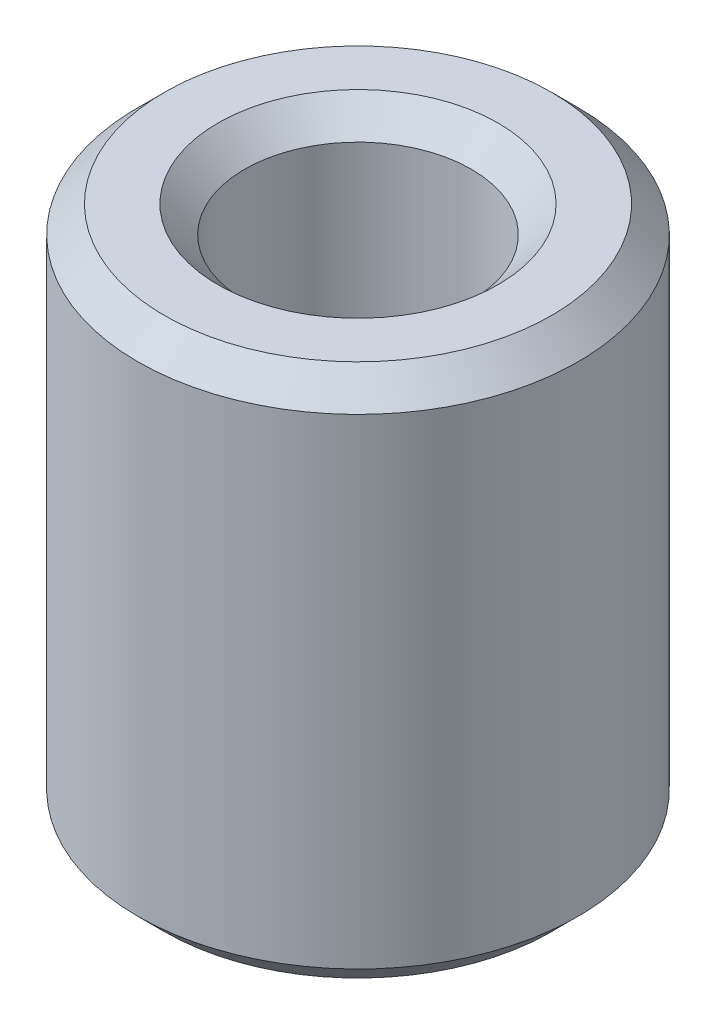
ISO-10303-21;
HEADER;
FILE_DESCRIPTION(('STEP AP214'),'2;1');
FILE_NAME('part.step','',(''),(''),'','','');
FILE_SCHEMA(('AUTOMOTIVE_DESIGN { 1 0 10303 214 1 1 1 1 }'));
ENDSEC;
DATA;
#1=APPLICATION_CONTEXT('core data for automotive mechanical design processes');
#2=APPLICATION_PROTOCOL_DEFINITION('international standard','automotive_design',2000,#1);
#3=PRODUCT_CONTEXT('',#1,'mechanical');
#4=PRODUCT('Part','Part','',(#3));
#5=PRODUCT_RELATED_PRODUCT_CATEGORY('part','',(#4));
#6=PRODUCT_DEFINITION_FORMATION('','',#4);
#7=PRODUCT_DEFINITION_CONTEXT('part definition',#1,'design');
#8=PRODUCT_DEFINITION('design','',#6,#7);
#9=PRODUCT_DEFINITION_SHAPE('','',#8);
#10=(LENGTH_UNIT() NAMED_UNIT(*) SI_UNIT(.MILLI.,.METRE.));
#11=(NAMED_UNIT(*) PLANE_ANGLE_UNIT() SI_UNIT($,.RADIAN.));
#12=(NAMED_UNIT(*) SI_UNIT($,.STERADIAN.) SOLID_ANGLE_UNIT());
#13=UNCERTAINTY_MEASURE_WITH_UNIT(LENGTH_MEASURE(1.E-05),#10,'distance_accuracy_value','');
#14=(GEOMETRIC_REPRESENTATION_CONTEXT(3) GLOBAL_UNCERTAINTY_ASSIGNED_CONTEXT((#13)) GLOBAL_UNIT_ASSIGNED_CONTEXT((#10,
#11,#12)) REPRESENTATION_CONTEXT('',''));
#15=CARTESIAN_POINT('',(0.,0.,0.));
#16=DIRECTION('',(0.,0.,1.));
#17=DIRECTION('',(1.,0.,0.));
#18=AXIS2_PLACEMENT_3D('',#15,#16,#17);
#19=CARTESIAN_POINT('',(0.,20.,8.25));
#20=DIRECTION('',(0.,-1.,0.));
#21=DIRECTION('',(0.,0.,-1.));
#22=AXIS2_PLACEMENT_3D('',#19,#20,#21);
#23=PLANE('',#22);
#24=CARTESIAN_POINT('',(0.,20.,0.));
#25=DIRECTION('',(0.,-1.,0.));
#26=DIRECTION('',(0.,0.,-1.));
#27=AXIS2_PLACEMENT_3D('',#24,#25,#26);
#28=CIRCLE('',#27,7.25);
#29=CARTESIAN_POINT('',(0.,20.,-7.25));
#30=VERTEX_POINT('',#29);
#31=EDGE_CURVE('E36',#30,#30,#28,.F.);
#32=ORIENTED_EDGE('',*,*,#31,.T.);
#33=EDGE_LOOP('',(#32));
#34=FACE_BOUND('',#33,.T.);
#35=CARTESIAN_POINT('',(0.,20.,0.));
#36=DIRECTION('',(0.,-1.,0.));
#37=DIRECTION('',(0.,0.,-1.));
#38=AXIS2_PLACEMENT_3D('',#35,#36,#37);
#39=CIRCLE('',#38,5.25);
#40=CARTESIAN_POINT('',(0.,20.,-5.25));
#41=VERTEX_POINT('',#40);
#42=EDGE_CURVE('E40',#41,#41,#39,.T.);
#43=ORIENTED_EDGE('',*,*,#42,.T.);
#44=EDGE_LOOP('',(#43));
#45=FACE_BOUND('',#44,.T.);
#46=ADVANCED_FACE('F29',(#34,#45),#23,.F.);
#47=CARTESIAN_POINT('',(0.,0.,0.));
#48=DIRECTION('',(0.,-1.,0.));
#49=DIRECTION('',(0.,0.,-1.));
#50=AXIS2_PLACEMENT_3D('',#47,#48,#49);
#51=CYLINDRICAL_SURFACE('',#50,4.25);
#52=CARTESIAN_POINT('',(0.,19.,0.));
#53=DIRECTION('',(0.,-1.,0.));
#54=DIRECTION('',(0.,0.,-1.));
#55=AXIS2_PLACEMENT_3D('',#52,#53,#54);
#56=CIRCLE('',#55,4.25);
#57=CARTESIAN_POINT('',(0.,19.,-4.25));
#58=VERTEX_POINT('',#57);
#59=EDGE_CURVE('E10',#58,#58,#56,.F.);
#60=ORIENTED_EDGE('',*,*,#59,.T.);
#61=EDGE_LOOP('',(#60));
#62=FACE_BOUND('',#61,.T.);
#63=CARTESIAN_POINT('',(0.,12.,0.));
#64=DIRECTION('',(0.,-1.,0.));
#65=DIRECTION('',(0.,0.,-1.));
#66=AXIS2_PLACEMENT_3D('',#63,#64,#65);
#67=CIRCLE('',#66,4.25);
#68=CARTESIAN_POINT('',(0.,12.,-4.25));
#69=VERTEX_POINT('',#68);
#70=EDGE_CURVE('E61',#69,#69,#67,.T.);
#71=ORIENTED_EDGE('',*,*,#70,.T.);
#72=EDGE_LOOP('',(#71));
#73=FACE_BOUND('',#72,.T.);
#74=ADVANCED_FACE('F82',(#62,#73),#51,.F.);
#75=CARTESIAN_POINT('',(0.,8.,0.));
#76=DIRECTION('',(0.,1.,0.));
#77=DIRECTION('',(0.,0.,1.));
#78=AXIS2_PLACEMENT_3D('',#75,#76,#77);
#79=CONICAL_SURFACE('',#78,2.75,0.358770670270572);
#80=ORIENTED_EDGE('',*,*,#70,.F.);
#81=EDGE_LOOP('',(#80));
#82=FACE_BOUND('',#81,.T.);
#83=CARTESIAN_POINT('',(0.,8.,0.));
#84=DIRECTION('',(0.,-1.,0.));
#85=DIRECTION('',(0.,0.,-1.));
#86=AXIS2_PLACEMENT_3D('',#83,#84,#85);
#87=CIRCLE('',#86,2.75);
#88=CARTESIAN_POINT('',(0.,8.,-2.75));
#89=VERTEX_POINT('',#88);
#90=EDGE_CURVE('E64',#89,#89,#87,.T.);
#91=ORIENTED_EDGE('',*,*,#90,.T.);
#92=EDGE_LOOP('',(#91));
#93=FACE_BOUND('',#92,.T.);
#94=ADVANCED_FACE('F68',(#82,#93),#79,.F.);
#95=CARTESIAN_POINT('',(0.,0.,0.));
#96=DIRECTION('',(0.,-1.,0.));
#97=DIRECTION('',(0.,0.,-1.));
#98=AXIS2_PLACEMENT_3D('',#95,#96,#97);
#99=CYLINDRICAL_SURFACE('',#98,2.75);
#100=CARTESIAN_POINT('',(0.,0.999999999999995,0.));
#101=DIRECTION('',(0.,1.,0.));
#102=DIRECTION('',(0.,0.,1.));
#103=AXIS2_PLACEMENT_3D('',#100,#101,#102);
#104=CIRCLE('',#103,2.75);
#105=CARTESIAN_POINT('',(0.,0.999999999999995,2.75));
#106=VERTEX_POINT('',#105);
#107=EDGE_CURVE('E44',#106,#106,#104,.F.);
#108=ORIENTED_EDGE('',*,*,#107,.T.);
#109=EDGE_LOOP('',(#108));
#110=FACE_BOUND('',#109,.T.);
#111=ORIENTED_EDGE('',*,*,#90,.F.);
#112=EDGE_LOOP('',(#111));
#113=FACE_BOUND('',#112,.T.);
#114=ADVANCED_FACE('F70',(#110,#113),#99,.F.);
#115=CARTESIAN_POINT('',(0.,0.,2.75));
#116=DIRECTION('',(0.,1.,0.));
#117=DIRECTION('',(0.,0.,1.));
#118=AXIS2_PLACEMENT_3D('',#115,#116,#117);
#119=PLANE('',#118);
#120=CARTESIAN_POINT('',(0.,0.,0.));
#121=DIRECTION('',(0.,1.,0.));
#122=DIRECTION('',(0.,0.,1.));
#123=AXIS2_PLACEMENT_3D('',#120,#121,#122);
#124=CIRCLE('',#123,7.25);
#125=CARTESIAN_POINT('',(0.,0.,7.25));
#126=VERTEX_POINT('',#125);
#127=EDGE_CURVE('E55',#126,#126,#124,.F.);
#128=ORIENTED_EDGE('',*,*,#127,.T.);
#129=EDGE_LOOP('',(#128));
#130=FACE_BOUND('',#129,.T.);
#131=CARTESIAN_POINT('',(0.,0.,0.));
#132=DIRECTION('',(0.,1.,0.));
#133=DIRECTION('',(0.,0.,1.));
#134=AXIS2_PLACEMENT_3D('',#131,#132,#133);
#135=CIRCLE('',#134,3.75);
#136=CARTESIAN_POINT('',(0.,0.,3.75));
#137=VERTEX_POINT('',#136);
#138=EDGE_CURVE('E58',#137,#137,#135,.T.);
#139=ORIENTED_EDGE('',*,*,#138,.T.);
#140=EDGE_LOOP('',(#139));
#141=FACE_BOUND('',#140,.T.);
#142=ADVANCED_FACE('F72',(#130,#141),#119,.F.);
#143=CARTESIAN_POINT('',(0.,0.,0.));
#144=DIRECTION('',(0.,-1.,0.));
#145=DIRECTION('',(0.,0.,-1.));
#146=AXIS2_PLACEMENT_3D('',#143,#144,#145);
#147=CYLINDRICAL_SURFACE('',#146,8.25);
#148=CARTESIAN_POINT('',(0.,1.00000000000001,0.));
#149=DIRECTION('',(0.,1.,0.));
#150=DIRECTION('',(0.,0.,1.));
#151=AXIS2_PLACEMENT_3D('',#148,#149,#150);
#152=CIRCLE('',#151,8.25);
#153=CARTESIAN_POINT('',(0.,1.00000000000001,8.25));
#154=VERTEX_POINT('',#153);
#155=EDGE_CURVE('E49',#154,#154,#152,.T.);
#156=ORIENTED_EDGE('',*,*,#155,.T.);
#157=EDGE_LOOP('',(#156));
#158=FACE_BOUND('',#157,.T.);
#159=CARTESIAN_POINT('',(0.,19.,0.));
#160=DIRECTION('',(0.,-1.,0.));
#161=DIRECTION('',(0.,0.,-1.));
#162=AXIS2_PLACEMENT_3D('',#159,#160,#161);
#163=CIRCLE('',#162,8.25);
#164=CARTESIAN_POINT('',(0.,19.,-8.25));
#165=VERTEX_POINT('',#164);
#166=EDGE_CURVE('E52',#165,#165,#163,.T.);
#167=ORIENTED_EDGE('',*,*,#166,.T.);
#168=EDGE_LOOP('',(#167));
#169=FACE_BOUND('',#168,.T.);
#170=ADVANCED_FACE('F79',(#158,#169),#147,.T.);
#171=CARTESIAN_POINT('',(0.,0.,0.));
#172=DIRECTION('',(0.,1.,0.));
#173=DIRECTION('',(0.,0.,1.));
#174=AXIS2_PLACEMENT_3D('',#171,#172,#173);
#175=CONICAL_SURFACE('',#174,7.25,0.785398163397447);
#176=ORIENTED_EDGE('',*,*,#155,.F.);
#177=EDGE_LOOP('',(#176));
#178=FACE_BOUND('',#177,.T.);
#179=ORIENTED_EDGE('',*,*,#127,.F.);
#180=EDGE_LOOP('',(#179));
#181=FACE_BOUND('',#180,.T.);
#182=ADVANCED_FACE('F93',(#178,#181),#175,.T.);
#183=CARTESIAN_POINT('',(0.,0.999999999999995,0.));
#184=DIRECTION('',(0.,-1.,0.));
#185=DIRECTION('',(0.,0.,-1.));
#186=AXIS2_PLACEMENT_3D('',#183,#184,#185);
#187=CONICAL_SURFACE('',#186,2.75,0.78539816339745);
#188=ORIENTED_EDGE('',*,*,#138,.F.);
#189=EDGE_LOOP('',(#188));
#190=FACE_BOUND('',#189,.T.);
#191=ORIENTED_EDGE('',*,*,#107,.F.);
#192=EDGE_LOOP('',(#191));
#193=FACE_BOUND('',#192,.T.);
#194=ADVANCED_FACE('F96',(#190,#193),#187,.F.);
#195=CARTESIAN_POINT('',(0.,19.,0.));
#196=DIRECTION('',(0.,-1.,0.));
#197=DIRECTION('',(0.,0.,-1.));
#198=AXIS2_PLACEMENT_3D('',#195,#196,#197);
#199=CONICAL_SURFACE('',#198,8.25,0.785398163397452);
#200=ORIENTED_EDGE('',*,*,#31,.F.);
#201=EDGE_LOOP('',(#200));
#202=FACE_BOUND('',#201,.T.);
#203=ORIENTED_EDGE('',*,*,#166,.F.);
#204=EDGE_LOOP('',(#203));
#205=FACE_BOUND('',#204,.T.);
#206=ADVANCED_FACE('F99',(#202,#205),#199,.T.);
#207=CARTESIAN_POINT('',(0.,20.,0.));
#208=DIRECTION('',(0.,1.,0.));
#209=DIRECTION('',(0.,0.,1.));
#210=AXIS2_PLACEMENT_3D('',#207,#208,#209);
#211=CONICAL_SURFACE('',#210,5.25,0.785398163397445);
#212=ORIENTED_EDGE('',*,*,#59,.F.);
#213=EDGE_LOOP('',(#212));
#214=FACE_BOUND('',#213,.T.);
#215=ORIENTED_EDGE('',*,*,#42,.F.);
#216=EDGE_LOOP('',(#215));
#217=FACE_BOUND('',#216,.T.);
#218=ADVANCED_FACE('F31',(#214,#217),#211,.F.);
#219=CLOSED_SHELL('',(#46,#74,#94,#114,#142,#170,#182,#194,#206,#218));
#220=MANIFOLD_SOLID_BREP('B2',#219);
#221=ADVANCED_BREP_SHAPE_REPRESENTATION('',(#18,#220),#14);
#222=SHAPE_DEFINITION_REPRESENTATION(#9,#221);
ENDSEC;
END-ISO-10303-21;
